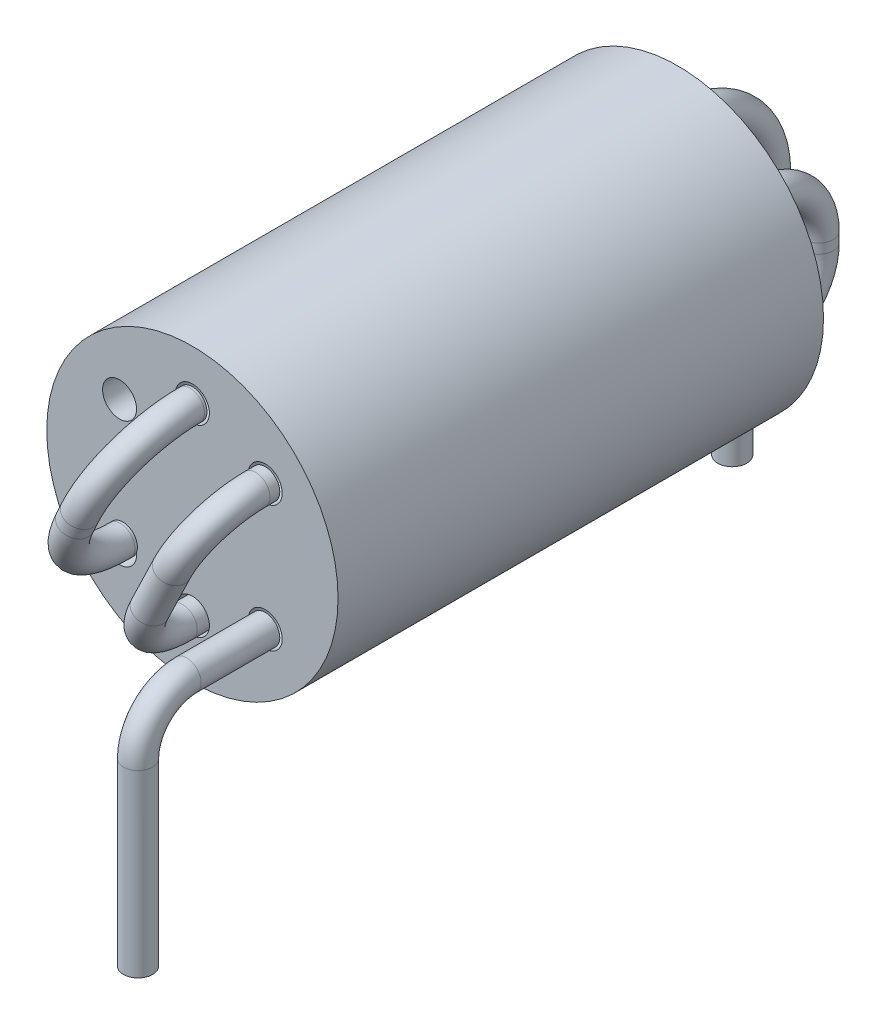
ISO-10303-21;
HEADER;
FILE_DESCRIPTION(('STEP AP214'),'2;1');
FILE_NAME('part.step','',(''),(''),'','','');
FILE_SCHEMA(('AUTOMOTIVE_DESIGN { 1 0 10303 214 1 1 1 1 }'));
ENDSEC;
DATA;
#1=APPLICATION_CONTEXT('core data for automotive mechanical design processes');
#2=APPLICATION_PROTOCOL_DEFINITION('international standard','automotive_design',2000,#1);
#3=PRODUCT_CONTEXT('',#1,'mechanical');
#4=PRODUCT('Part','Part','',(#3));
#5=PRODUCT_RELATED_PRODUCT_CATEGORY('part','',(#4));
#6=PRODUCT_DEFINITION_FORMATION('','',#4);
#7=PRODUCT_DEFINITION_CONTEXT('part definition',#1,'design');
#8=PRODUCT_DEFINITION('design','',#6,#7);
#9=PRODUCT_DEFINITION_SHAPE('','',#8);
#10=(LENGTH_UNIT() NAMED_UNIT(*) SI_UNIT(.MILLI.,.METRE.));
#11=(NAMED_UNIT(*) PLANE_ANGLE_UNIT() SI_UNIT($,.RADIAN.));
#12=(NAMED_UNIT(*) SI_UNIT($,.STERADIAN.) SOLID_ANGLE_UNIT());
#13=UNCERTAINTY_MEASURE_WITH_UNIT(LENGTH_MEASURE(1.E-05),#10,'distance_accuracy_value','');
#14=(GEOMETRIC_REPRESENTATION_CONTEXT(3) GLOBAL_UNCERTAINTY_ASSIGNED_CONTEXT((#13)) GLOBAL_UNIT_ASSIGNED_CONTEXT((#10,
#11,#12)) REPRESENTATION_CONTEXT('',''));
#15=CARTESIAN_POINT('',(0.,0.,0.));
#16=DIRECTION('',(0.,0.,1.));
#17=DIRECTION('',(1.,0.,0.));
#18=AXIS2_PLACEMENT_3D('',#15,#16,#17);
#19=CARTESIAN_POINT('',(5.75283767472248E-05,-1.80959341750815,10.2));
#20=DIRECTION('',(0.,0.,-1.));
#21=DIRECTION('',(0.,1.,0.));
#22=AXIS2_PLACEMENT_3D('',#19,#20,#21);
#23=CYLINDRICAL_SURFACE('',#22,0.3);
#24=CARTESIAN_POINT('',(5.75283767472248E-05,-1.80959341750815,10.2));
#25=DIRECTION('',(0.,0.,-1.));
#26=DIRECTION('',(0.622493133075413,-0.782625261075795,0.));
#27=AXIS2_PLACEMENT_3D('',#24,#25,#26);
#28=CIRCLE('',#27,0.3);
#29=CARTESIAN_POINT('',(-0.130279761036552,-2.07980109872464,10.2));
#30=VERTEX_POINT('',#29);
#31=EDGE_CURVE('E50',#30,#30,#28,.T.);
#32=ORIENTED_EDGE('',*,*,#31,.T.);
#33=EDGE_LOOP('',(#32));
#34=FACE_BOUND('',#33,.T.);
#35=CARTESIAN_POINT('',(5.75283767471164E-05,-1.80959341750815,9.80414751834978));
#36=DIRECTION('',(0.,0.,-1.));
#37=DIRECTION('',(0.622493133075413,-0.782625261075795,0.));
#38=AXIS2_PLACEMENT_3D('',#35,#36,#37);
#39=CIRCLE('',#38,0.3);
#40=CARTESIAN_POINT('',(0.186805468299371,-2.04438099583089,9.80414751834978));
#41=VERTEX_POINT('',#40);
#42=EDGE_CURVE('E11',#41,#41,#39,.T.);
#43=ORIENTED_EDGE('',*,*,#42,.F.);
#44=EDGE_LOOP('',(#43));
#45=FACE_BOUND('',#44,.T.);
#46=ADVANCED_FACE('F43',(#34,#45),#23,.T.);
#47=CARTESIAN_POINT('',(0.521406686029949,-0.728762692642181,10.2));
#48=DIRECTION('',(0.900692270721641,-0.434457631377668,0.));
#49=DIRECTION('',(0.434457631377668,0.900692270721641,0.));
#50=AXIS2_PLACEMENT_3D('',#47,#48,#49);
#51=TOROIDAL_SURFACE('',#50,1.2,0.3);
#52=CARTESIAN_POINT('',(0.521406686029949,-0.728762692642181,11.4));
#53=DIRECTION('',(-0.434457631377668,-0.900692270721641,0.));
#54=DIRECTION('',(0.811246566537707,-0.391312630537898,0.434457631377668));
#55=AXIS2_PLACEMENT_3D('',#52,#53,#54);
#56=CIRCLE('',#55,0.3);
#57=CARTESIAN_POINT('',(0.521406686029949,-0.728762692642181,11.7));
#58=VERTEX_POINT('',#57);
#59=EDGE_CURVE('E56',#58,#58,#56,.T.);
#60=CARTESIAN_POINT('',(0.521406686029949,-0.728762692642181,10.2));
#61=DIRECTION('',(0.900692270721641,-0.434457631377668,0.));
#62=DIRECTION('',(0.434457631377668,0.900692270721641,0.));
#63=AXIS2_PLACEMENT_3D('',#60,#61,#62);
#64=CIRCLE('',#63,1.5);
#65=EDGE_CURVE('',#58,#30,#64,.T.);
#66=ORIENTED_EDGE('',*,*,#59,.T.);
#67=ORIENTED_EDGE('',*,*,#31,.F.);
#68=ORIENTED_EDGE('',*,*,#65,.T.);
#69=ORIENTED_EDGE('',*,*,#65,.F.);
#70=EDGE_LOOP('',(#66,#68,#67,#69));
#71=FACE_BOUND('',#70,.T.);
#72=ADVANCED_FACE('F92',(#71),#51,.T.);
#73=CARTESIAN_POINT('',(0.978650842346798,0.21916927513403,11.4));
#74=DIRECTION('',(-0.434457631377668,-0.900692270721641,0.));
#75=DIRECTION('',(0.900692270721641,-0.434457631377668,0.));
#76=AXIS2_PLACEMENT_3D('',#73,#74,#75);
#77=CYLINDRICAL_SURFACE('',#76,0.3);
#78=CARTESIAN_POINT('',(0.978650842346798,0.21916927513403,11.4));
#79=DIRECTION('',(-0.434457631377668,-0.900692270721641,0.));
#80=DIRECTION('',(0.811246566537707,-0.391312630537898,0.434457631377668));
#81=AXIS2_PLACEMENT_3D('',#78,#79,#80);
#82=CIRCLE('',#81,0.3);
#83=CARTESIAN_POINT('',(0.978650842346798,0.21916927513403,11.7));
#84=VERTEX_POINT('',#83);
#85=EDGE_CURVE('E61',#84,#84,#82,.T.);
#86=ORIENTED_EDGE('',*,*,#85,.T.);
#87=EDGE_LOOP('',(#86));
#88=FACE_BOUND('',#87,.T.);
#89=ORIENTED_EDGE('',*,*,#59,.F.);
#90=EDGE_LOOP('',(#89));
#91=FACE_BOUND('',#90,.T.);
#92=ADVANCED_FACE('F95',(#88,#91),#77,.T.);
#93=CARTESIAN_POINT('',(0.978650842346798,0.21916927513403,10.2));
#94=DIRECTION('',(0.900692270721641,-0.434457631377668,0.));
#95=DIRECTION('',(0.434457631377668,0.900692270721641,0.));
#96=AXIS2_PLACEMENT_3D('',#93,#94,#95);
#97=TOROIDAL_SURFACE('',#96,1.2,0.3);
#98=CARTESIAN_POINT('',(1.5,1.3,10.2));
#99=DIRECTION('',(0.,0.,1.));
#100=DIRECTION('',(1.,0.,0.));
#101=AXIS2_PLACEMENT_3D('',#98,#99,#100);
#102=CIRCLE('',#101,0.3);
#103=CARTESIAN_POINT('',(1.6303372894133,1.57020768121649,10.2));
#104=VERTEX_POINT('',#103);
#105=EDGE_CURVE('E66',#104,#104,#102,.T.);
#106=CARTESIAN_POINT('',(0.978650842346798,0.21916927513403,10.2));
#107=DIRECTION('',(0.900692270721641,-0.434457631377668,0.));
#108=DIRECTION('',(0.434457631377668,0.900692270721641,0.));
#109=AXIS2_PLACEMENT_3D('',#106,#107,#108);
#110=CIRCLE('',#109,1.5);
#111=EDGE_CURVE('',#104,#84,#110,.T.);
#112=ORIENTED_EDGE('',*,*,#105,.T.);
#113=ORIENTED_EDGE('',*,*,#85,.F.);
#114=ORIENTED_EDGE('',*,*,#111,.T.);
#115=ORIENTED_EDGE('',*,*,#111,.F.);
#116=EDGE_LOOP('',(#112,#114,#113,#115));
#117=FACE_BOUND('',#116,.T.);
#118=ADVANCED_FACE('F75',(#117),#97,.T.);
#119=CARTESIAN_POINT('',(1.5,1.3,10.2));
#120=DIRECTION('',(0.,0.,-1.));
#121=DIRECTION('',(-1.,0.,0.));
#122=AXIS2_PLACEMENT_3D('',#119,#120,#121);
#123=CYLINDRICAL_SURFACE('',#122,0.3);
#124=ORIENTED_EDGE('',*,*,#105,.F.);
#125=EDGE_LOOP('',(#124));
#126=FACE_BOUND('',#125,.T.);
#127=CARTESIAN_POINT('',(1.5,1.3,10.));
#128=DIRECTION('',(0.,0.,1.));
#129=DIRECTION('',(1.,0.,0.));
#130=AXIS2_PLACEMENT_3D('',#127,#128,#129);
#131=CIRCLE('',#130,0.3);
#132=CARTESIAN_POINT('',(1.8,1.3,10.));
#133=VERTEX_POINT('',#132);
#134=EDGE_CURVE('E67',#133,#133,#131,.T.);
#135=ORIENTED_EDGE('',*,*,#134,.T.);
#136=EDGE_LOOP('',(#135));
#137=FACE_BOUND('',#136,.T.);
#138=ADVANCED_FACE('F78',(#126,#137),#123,.T.);
#139=CARTESIAN_POINT('',(5.75283767471164E-05,-1.80959341750815,9.80414751834978));
#140=DIRECTION('',(0.,0.,-1.));
#141=DIRECTION('',(0.622493133075413,-0.782625261075795,0.));
#142=AXIS2_PLACEMENT_3D('',#139,#140,#141);
#143=PLANE('',#142);
#144=ORIENTED_EDGE('',*,*,#42,.T.);
#145=EDGE_LOOP('',(#144));
#146=FACE_BOUND('',#145,.T.);
#147=ADVANCED_FACE('F81',(#146),#143,.T.);
#148=CARTESIAN_POINT('',(1.5,1.3,10.));
#149=DIRECTION('',(0.,0.,1.));
#150=DIRECTION('',(1.,0.,0.));
#151=AXIS2_PLACEMENT_3D('',#148,#149,#150);
#152=PLANE('',#151);
#153=ORIENTED_EDGE('',*,*,#134,.F.);
#154=EDGE_LOOP('',(#153));
#155=FACE_BOUND('',#154,.T.);
#156=ADVANCED_FACE('F85',(#155),#152,.F.);
#157=CLOSED_SHELL('',(#46,#72,#92,#118,#138,#147,#156));
#158=MANIFOLD_SOLID_BREP('B2',#157);
#159=CARTESIAN_POINT('',(1.5,-1.3,-0.2));
#160=DIRECTION('',(0.,0.,1.));
#161=DIRECTION('',(0.,-1.,0.));
#162=AXIS2_PLACEMENT_3D('',#159,#160,#161);
#163=CYLINDRICAL_SURFACE('',#162,0.3);
#164=CARTESIAN_POINT('',(1.5,-1.3,-0.2));
#165=DIRECTION('',(0.,0.,1.));
#166=DIRECTION('',(-1.,0.,0.));
#167=AXIS2_PLACEMENT_3D('',#164,#165,#166);
#168=CIRCLE('',#167,0.3);
#169=CARTESIAN_POINT('',(1.5,-1.6,-0.2));
#170=VERTEX_POINT('',#169);
#171=EDGE_CURVE('E171',#170,#170,#168,.T.);
#172=ORIENTED_EDGE('',*,*,#171,.T.);
#173=EDGE_LOOP('',(#172));
#174=FACE_BOUND('',#173,.T.);
#175=CARTESIAN_POINT('',(1.5,-1.3,0.));
#176=DIRECTION('',(0.,0.,1.));
#177=DIRECTION('',(-1.,0.,0.));
#178=AXIS2_PLACEMENT_3D('',#175,#176,#177);
#179=CIRCLE('',#178,0.3);
#180=CARTESIAN_POINT('',(1.2,-1.3,0.));
#181=VERTEX_POINT('',#180);
#182=EDGE_CURVE('E42',#181,#181,#179,.T.);
#183=ORIENTED_EDGE('',*,*,#182,.F.);
#184=EDGE_LOOP('',(#183));
#185=FACE_BOUND('',#184,.T.);
#186=ADVANCED_FACE('F164',(#174,#185),#163,.T.);
#187=CARTESIAN_POINT('',(1.5,-0.1,-0.2));
#188=DIRECTION('',(-1.,0.,0.));
#189=DIRECTION('',(0.,0.,1.));
#190=AXIS2_PLACEMENT_3D('',#187,#188,#189);
#191=TOROIDAL_SURFACE('',#190,1.2,0.3);
#192=CARTESIAN_POINT('',(1.5,-0.1,-1.4));
#193=DIRECTION('',(0.,-1.,0.));
#194=DIRECTION('',(-1.,0.,0.));
#195=AXIS2_PLACEMENT_3D('',#192,#193,#194);
#196=CIRCLE('',#195,0.3);
#197=CARTESIAN_POINT('',(1.5,-0.0999999999999999,-1.7));
#198=VERTEX_POINT('',#197);
#199=EDGE_CURVE('E177',#198,#198,#196,.T.);
#200=CARTESIAN_POINT('',(1.5,-0.1,-0.2));
#201=DIRECTION('',(-1.,0.,0.));
#202=DIRECTION('',(0.,0.,1.));
#203=AXIS2_PLACEMENT_3D('',#200,#201,#202);
#204=CIRCLE('',#203,1.5);
#205=EDGE_CURVE('',#198,#170,#204,.T.);
#206=ORIENTED_EDGE('',*,*,#199,.T.);
#207=ORIENTED_EDGE('',*,*,#171,.F.);
#208=ORIENTED_EDGE('',*,*,#205,.T.);
#209=ORIENTED_EDGE('',*,*,#205,.F.);
#210=EDGE_LOOP('',(#206,#208,#207,#209));
#211=FACE_BOUND('',#210,.T.);
#212=ADVANCED_FACE('F213',(#211),#191,.T.);
#213=CARTESIAN_POINT('',(1.5,0.1,-1.4));
#214=DIRECTION('',(0.,-1.,0.));
#215=DIRECTION('',(0.,0.,-1.));
#216=AXIS2_PLACEMENT_3D('',#213,#214,#215);
#217=CYLINDRICAL_SURFACE('',#216,0.3);
#218=CARTESIAN_POINT('',(1.5,0.1,-1.4));
#219=DIRECTION('',(0.,-1.,0.));
#220=DIRECTION('',(-1.,0.,0.));
#221=AXIS2_PLACEMENT_3D('',#218,#219,#220);
#222=CIRCLE('',#221,0.3);
#223=CARTESIAN_POINT('',(1.5,0.1,-1.7));
#224=VERTEX_POINT('',#223);
#225=EDGE_CURVE('E183',#224,#224,#222,.T.);
#226=ORIENTED_EDGE('',*,*,#225,.T.);
#227=EDGE_LOOP('',(#226));
#228=FACE_BOUND('',#227,.T.);
#229=ORIENTED_EDGE('',*,*,#199,.F.);
#230=EDGE_LOOP('',(#229));
#231=FACE_BOUND('',#230,.T.);
#232=ADVANCED_FACE('F216',(#228,#231),#217,.T.);
#233=CARTESIAN_POINT('',(1.5,0.1,-0.2));
#234=DIRECTION('',(-1.,0.,0.));
#235=DIRECTION('',(0.,0.,1.));
#236=AXIS2_PLACEMENT_3D('',#233,#234,#235);
#237=TOROIDAL_SURFACE('',#236,1.2,0.3);
#238=CARTESIAN_POINT('',(1.5,1.3,-0.2));
#239=DIRECTION('',(0.,0.,-1.));
#240=DIRECTION('',(-1.,0.,0.));
#241=AXIS2_PLACEMENT_3D('',#238,#239,#240);
#242=CIRCLE('',#241,0.3);
#243=CARTESIAN_POINT('',(1.5,1.6,-0.2));
#244=VERTEX_POINT('',#243);
#245=EDGE_CURVE('E189',#244,#244,#242,.T.);
#246=CARTESIAN_POINT('',(1.5,0.1,-0.2));
#247=DIRECTION('',(-1.,0.,0.));
#248=DIRECTION('',(0.,0.,1.));
#249=AXIS2_PLACEMENT_3D('',#246,#247,#248);
#250=CIRCLE('',#249,1.5);
#251=EDGE_CURVE('',#244,#224,#250,.T.);
#252=ORIENTED_EDGE('',*,*,#245,.T.);
#253=ORIENTED_EDGE('',*,*,#225,.F.);
#254=ORIENTED_EDGE('',*,*,#251,.T.);
#255=ORIENTED_EDGE('',*,*,#251,.F.);
#256=EDGE_LOOP('',(#252,#254,#253,#255));
#257=FACE_BOUND('',#256,.T.);
#258=ADVANCED_FACE('F196',(#257),#237,.T.);
#259=CARTESIAN_POINT('',(1.5,1.3,-0.2));
#260=DIRECTION('',(0.,0.,1.));
#261=DIRECTION('',(0.,-1.,0.));
#262=AXIS2_PLACEMENT_3D('',#259,#260,#261);
#263=CYLINDRICAL_SURFACE('',#262,0.3);
#264=ORIENTED_EDGE('',*,*,#245,.F.);
#265=EDGE_LOOP('',(#264));
#266=FACE_BOUND('',#265,.T.);
#267=CARTESIAN_POINT('',(1.5,1.3,0.));
#268=DIRECTION('',(0.,0.,-1.));
#269=DIRECTION('',(-1.,0.,0.));
#270=AXIS2_PLACEMENT_3D('',#267,#268,#269);
#271=CIRCLE('',#270,0.3);
#272=CARTESIAN_POINT('',(1.2,1.3,0.));
#273=VERTEX_POINT('',#272);
#274=EDGE_CURVE('E190',#273,#273,#271,.T.);
#275=ORIENTED_EDGE('',*,*,#274,.T.);
#276=EDGE_LOOP('',(#275));
#277=FACE_BOUND('',#276,.T.);
#278=ADVANCED_FACE('F199',(#266,#277),#263,.T.);
#279=CARTESIAN_POINT('',(1.5,-1.3,0.));
#280=DIRECTION('',(0.,0.,1.));
#281=DIRECTION('',(-1.,0.,0.));
#282=AXIS2_PLACEMENT_3D('',#279,#280,#281);
#283=PLANE('',#282);
#284=ORIENTED_EDGE('',*,*,#182,.T.);
#285=EDGE_LOOP('',(#284));
#286=FACE_BOUND('',#285,.T.);
#287=ADVANCED_FACE('F202',(#286),#283,.T.);
#288=CARTESIAN_POINT('',(1.5,1.3,0.));
#289=DIRECTION('',(0.,0.,-1.));
#290=DIRECTION('',(-1.,0.,0.));
#291=AXIS2_PLACEMENT_3D('',#288,#289,#290);
#292=PLANE('',#291);
#293=ORIENTED_EDGE('',*,*,#274,.F.);
#294=EDGE_LOOP('',(#293));
#295=FACE_BOUND('',#294,.T.);
#296=ADVANCED_FACE('F206',(#295),#292,.F.);
#297=CLOSED_SHELL('',(#186,#212,#232,#258,#278,#287,#296));
#298=MANIFOLD_SOLID_BREP('B6',#297);
#299=CARTESIAN_POINT('',(-1.5,-2.30000000000001,-2.62));
#300=DIRECTION('',(0.,-1.,0.));
#301=DIRECTION('',(0.,0.,-1.));
#302=AXIS2_PLACEMENT_3D('',#299,#300,#301);
#303=CYLINDRICAL_SURFACE('',#302,0.3);
#304=CARTESIAN_POINT('',(-1.5,-2.30000000000001,-2.62));
#305=DIRECTION('',(0.,-1.,0.));
#306=DIRECTION('',(-1.,0.,0.));
#307=AXIS2_PLACEMENT_3D('',#304,#305,#306);
#308=CIRCLE('',#307,0.3);
#309=CARTESIAN_POINT('',(-1.5,-2.30000000000001,-2.92));
#310=VERTEX_POINT('',#309);
#311=EDGE_CURVE('E292',#310,#310,#308,.T.);
#312=ORIENTED_EDGE('',*,*,#311,.T.);
#313=EDGE_LOOP('',(#312));
#314=FACE_BOUND('',#313,.T.);
#315=CARTESIAN_POINT('',(-1.5,-6.,-2.62));
#316=DIRECTION('',(0.,-1.,0.));
#317=DIRECTION('',(-1.,0.,0.));
#318=AXIS2_PLACEMENT_3D('',#315,#316,#317);
#319=CIRCLE('',#318,0.3);
#320=CARTESIAN_POINT('',(-1.8,-6.,-2.62));
#321=VERTEX_POINT('',#320);
#322=EDGE_CURVE('E163',#321,#321,#319,.T.);
#323=ORIENTED_EDGE('',*,*,#322,.F.);
#324=EDGE_LOOP('',(#323));
#325=FACE_BOUND('',#324,.T.);
#326=ADVANCED_FACE('F285',(#314,#325),#303,.T.);
#327=CARTESIAN_POINT('',(-1.5,-2.3,-1.62));
#328=DIRECTION('',(-1.,0.,0.));
#329=DIRECTION('',(0.,0.,1.));
#330=AXIS2_PLACEMENT_3D('',#327,#328,#329);
#331=TOROIDAL_SURFACE('',#330,1.,0.3);
#332=CARTESIAN_POINT('',(-1.5,-1.3,-1.61999999999999));
#333=DIRECTION('',(0.,0.,-1.));
#334=DIRECTION('',(-1.,0.,0.));
#335=AXIS2_PLACEMENT_3D('',#332,#333,#334);
#336=CIRCLE('',#335,0.3);
#337=CARTESIAN_POINT('',(-1.5,-1.,-1.61999999999999));
#338=VERTEX_POINT('',#337);
#339=EDGE_CURVE('E298',#338,#338,#336,.T.);
#340=CARTESIAN_POINT('',(-1.5,-2.3,-1.62));
#341=DIRECTION('',(-1.,0.,0.));
#342=DIRECTION('',(0.,0.,1.));
#343=AXIS2_PLACEMENT_3D('',#340,#341,#342);
#344=CIRCLE('',#343,1.3);
#345=EDGE_CURVE('',#338,#310,#344,.T.);
#346=ORIENTED_EDGE('',*,*,#339,.T.);
#347=ORIENTED_EDGE('',*,*,#311,.F.);
#348=ORIENTED_EDGE('',*,*,#345,.T.);
#349=ORIENTED_EDGE('',*,*,#345,.F.);
#350=EDGE_LOOP('',(#346,#348,#347,#349));
#351=FACE_BOUND('',#350,.T.);
#352=ADVANCED_FACE('F320',(#351),#331,.T.);
#353=CARTESIAN_POINT('',(-1.5,-1.3,-1.61999999999999));
#354=DIRECTION('',(0.,0.,1.));
#355=DIRECTION('',(1.,0.,0.));
#356=AXIS2_PLACEMENT_3D('',#353,#354,#355);
#357=CYLINDRICAL_SURFACE('',#356,0.3);
#358=ORIENTED_EDGE('',*,*,#339,.F.);
#359=EDGE_LOOP('',(#358));
#360=FACE_BOUND('',#359,.T.);
#361=CARTESIAN_POINT('',(-1.5,-1.3,0.));
#362=DIRECTION('',(0.,0.,-1.));
#363=DIRECTION('',(-1.,0.,0.));
#364=AXIS2_PLACEMENT_3D('',#361,#362,#363);
#365=CIRCLE('',#364,0.3);
#366=CARTESIAN_POINT('',(-1.8,-1.3,0.));
#367=VERTEX_POINT('',#366);
#368=EDGE_CURVE('E303',#367,#367,#365,.T.);
#369=ORIENTED_EDGE('',*,*,#368,.T.);
#370=EDGE_LOOP('',(#369));
#371=FACE_BOUND('',#370,.T.);
#372=ADVANCED_FACE('F309',(#360,#371),#357,.T.);
#373=CARTESIAN_POINT('',(-1.5,-6.,-2.62));
#374=DIRECTION('',(0.,-1.,0.));
#375=DIRECTION('',(-1.,0.,0.));
#376=AXIS2_PLACEMENT_3D('',#373,#374,#375);
#377=PLANE('',#376);
#378=ORIENTED_EDGE('',*,*,#322,.T.);
#379=EDGE_LOOP('',(#378));
#380=FACE_BOUND('',#379,.T.);
#381=ADVANCED_FACE('F313',(#380),#377,.T.);
#382=CARTESIAN_POINT('',(-1.5,-1.3,0.));
#383=DIRECTION('',(0.,0.,-1.));
#384=DIRECTION('',(-1.,0.,0.));
#385=AXIS2_PLACEMENT_3D('',#382,#383,#384);
#386=PLANE('',#385);
#387=ORIENTED_EDGE('',*,*,#368,.F.);
#388=EDGE_LOOP('',(#387));
#389=FACE_BOUND('',#388,.T.);
#390=ADVANCED_FACE('F311',(#389),#386,.F.);
#391=CLOSED_SHELL('',(#326,#352,#372,#381,#390));
#392=MANIFOLD_SOLID_BREP('B37',#391);
#393=CARTESIAN_POINT('',(0.,-1.80971268198998,-0.100000000000001));
#394=DIRECTION('',(0.,0.,1.));
#395=DIRECTION('',(1.,0.,0.));
#396=AXIS2_PLACEMENT_3D('',#393,#394,#395);
#397=CYLINDRICAL_SURFACE('',#396,0.299999999999999);
#398=CARTESIAN_POINT('',(0.,-1.80971268198998,-0.100000000000001));
#399=DIRECTION('',(0.,0.,1.));
#400=DIRECTION('',(-1.,0.,0.));
#401=AXIS2_PLACEMENT_3D('',#398,#399,#400);
#402=CIRCLE('',#401,0.299999999999999);
#403=CARTESIAN_POINT('',(0.,-2.10971268198998,-0.100000000000001));
#404=VERTEX_POINT('',#403);
#405=EDGE_CURVE('E379',#404,#404,#402,.T.);
#406=ORIENTED_EDGE('',*,*,#405,.T.);
#407=EDGE_LOOP('',(#406));
#408=FACE_BOUND('',#407,.T.);
#409=CARTESIAN_POINT('',(0.,-1.80971268198998,0.));
#410=DIRECTION('',(0.,0.,1.));
#411=DIRECTION('',(-1.,0.,0.));
#412=AXIS2_PLACEMENT_3D('',#409,#410,#411);
#413=CIRCLE('',#412,0.299999999999999);
#414=CARTESIAN_POINT('',(-0.299999999999999,-1.80971268198998,0.));
#415=VERTEX_POINT('',#414);
#416=EDGE_CURVE('E284',#415,#415,#413,.T.);
#417=ORIENTED_EDGE('',*,*,#416,.F.);
#418=EDGE_LOOP('',(#417));
#419=FACE_BOUND('',#418,.T.);
#420=ADVANCED_FACE('F372',(#408,#419),#397,.T.);
#421=CARTESIAN_POINT('',(0.,-0.00971268198998101,-0.1));
#422=DIRECTION('',(-1.,0.,0.));
#423=DIRECTION('',(0.,0.,1.));
#424=AXIS2_PLACEMENT_3D('',#421,#422,#423);
#425=TOROIDAL_SURFACE('',#424,1.8,0.299999999999999);
#426=CARTESIAN_POINT('',(0.,-0.00971268198998067,-1.9));
#427=DIRECTION('',(0.,-1.,0.));
#428=DIRECTION('',(-1.,0.,0.));
#429=AXIS2_PLACEMENT_3D('',#426,#427,#428);
#430=CIRCLE('',#429,0.299999999999999);
#431=CARTESIAN_POINT('',(0.,-0.00971268198998062,-2.2));
#432=VERTEX_POINT('',#431);
#433=EDGE_CURVE('E386',#432,#432,#430,.T.);
#434=CARTESIAN_POINT('',(0.,-0.00971268198998101,-0.1));
#435=DIRECTION('',(-1.,0.,0.));
#436=DIRECTION('',(0.,0.,1.));
#437=AXIS2_PLACEMENT_3D('',#434,#435,#436);
#438=CIRCLE('',#437,2.1);
#439=EDGE_CURVE('',#432,#404,#438,.T.);
#440=ORIENTED_EDGE('',*,*,#433,.T.);
#441=ORIENTED_EDGE('',*,*,#405,.F.);
#442=ORIENTED_EDGE('',*,*,#439,.T.);
#443=ORIENTED_EDGE('',*,*,#439,.F.);
#444=EDGE_LOOP('',(#440,#442,#441,#443));
#445=FACE_BOUND('',#444,.T.);
#446=ADVANCED_FACE('F421',(#445),#425,.T.);
#447=CARTESIAN_POINT('',(0.,0.176891682635779,-1.9));
#448=DIRECTION('',(0.,-1.,0.));
#449=DIRECTION('',(0.,0.,-1.));
#450=AXIS2_PLACEMENT_3D('',#447,#448,#449);
#451=CYLINDRICAL_SURFACE('',#450,0.299999999999999);
#452=CARTESIAN_POINT('',(0.,0.176891682635779,-1.9));
#453=DIRECTION('',(0.,-1.,0.));
#454=DIRECTION('',(-1.,0.,0.));
#455=AXIS2_PLACEMENT_3D('',#452,#453,#454);
#456=CIRCLE('',#455,0.299999999999999);
#457=CARTESIAN_POINT('',(0.,0.176891682635779,-2.2));
#458=VERTEX_POINT('',#457);
#459=EDGE_CURVE('E392',#458,#458,#456,.T.);
#460=ORIENTED_EDGE('',*,*,#459,.T.);
#461=EDGE_LOOP('',(#460));
#462=FACE_BOUND('',#461,.T.);
#463=ORIENTED_EDGE('',*,*,#433,.F.);
#464=EDGE_LOOP('',(#463));
#465=FACE_BOUND('',#464,.T.);
#466=ADVANCED_FACE('F424',(#462,#465),#451,.T.);
#467=CARTESIAN_POINT('',(0.,0.176891682635779,-0.1));
#468=DIRECTION('',(-1.,0.,0.));
#469=DIRECTION('',(0.,0.,1.));
#470=AXIS2_PLACEMENT_3D('',#467,#468,#469);
#471=TOROIDAL_SURFACE('',#470,1.8,0.299999999999999);
#472=CARTESIAN_POINT('',(0.,1.97689168263578,-0.1));
#473=DIRECTION('',(0.,0.,-1.));
#474=DIRECTION('',(-1.,0.,0.));
#475=AXIS2_PLACEMENT_3D('',#472,#473,#474);
#476=CIRCLE('',#475,0.299999999999999);
#477=CARTESIAN_POINT('',(0.,2.27689168263578,-0.1));
#478=VERTEX_POINT('',#477);
#479=EDGE_CURVE('E397',#478,#478,#476,.T.);
#480=CARTESIAN_POINT('',(0.,0.176891682635779,-0.1));
#481=DIRECTION('',(-1.,0.,0.));
#482=DIRECTION('',(0.,0.,1.));
#483=AXIS2_PLACEMENT_3D('',#480,#481,#482);
#484=CIRCLE('',#483,2.1);
#485=EDGE_CURVE('',#478,#458,#484,.T.);
#486=ORIENTED_EDGE('',*,*,#479,.T.);
#487=ORIENTED_EDGE('',*,*,#459,.F.);
#488=ORIENTED_EDGE('',*,*,#485,.T.);
#489=ORIENTED_EDGE('',*,*,#485,.F.);
#490=EDGE_LOOP('',(#486,#488,#487,#489));
#491=FACE_BOUND('',#490,.T.);
#492=ADVANCED_FACE('F404',(#491),#471,.T.);
#493=CARTESIAN_POINT('',(0.,1.97689168263578,-0.1));
#494=DIRECTION('',(0.,0.,1.));
#495=DIRECTION('',(0.,-1.,0.));
#496=AXIS2_PLACEMENT_3D('',#493,#494,#495);
#497=CYLINDRICAL_SURFACE('',#496,0.299999999999999);
#498=ORIENTED_EDGE('',*,*,#479,.F.);
#499=EDGE_LOOP('',(#498));
#500=FACE_BOUND('',#499,.T.);
#501=CARTESIAN_POINT('',(0.,1.97689168263578,0.));
#502=DIRECTION('',(0.,0.,-1.));
#503=DIRECTION('',(-1.,0.,0.));
#504=AXIS2_PLACEMENT_3D('',#501,#502,#503);
#505=CIRCLE('',#504,0.299999999999999);
#506=CARTESIAN_POINT('',(-0.299999999999999,1.97689168263578,0.));
#507=VERTEX_POINT('',#506);
#508=EDGE_CURVE('E398',#507,#507,#505,.T.);
#509=ORIENTED_EDGE('',*,*,#508,.T.);
#510=EDGE_LOOP('',(#509));
#511=FACE_BOUND('',#510,.T.);
#512=ADVANCED_FACE('F407',(#500,#511),#497,.T.);
#513=CARTESIAN_POINT('',(0.,-1.80971268198998,0.));
#514=DIRECTION('',(0.,0.,1.));
#515=DIRECTION('',(-1.,0.,0.));
#516=AXIS2_PLACEMENT_3D('',#513,#514,#515);
#517=PLANE('',#516);
#518=ORIENTED_EDGE('',*,*,#416,.T.);
#519=EDGE_LOOP('',(#518));
#520=FACE_BOUND('',#519,.T.);
#521=ADVANCED_FACE('F410',(#520),#517,.T.);
#522=CARTESIAN_POINT('',(0.,1.97689168263578,0.));
#523=DIRECTION('',(0.,0.,-1.));
#524=DIRECTION('',(-1.,0.,0.));
#525=AXIS2_PLACEMENT_3D('',#522,#523,#524);
#526=PLANE('',#525);
#527=ORIENTED_EDGE('',*,*,#508,.F.);
#528=EDGE_LOOP('',(#527));
#529=FACE_BOUND('',#528,.T.);
#530=ADVANCED_FACE('F414',(#529),#526,.F.);
#531=CLOSED_SHELL('',(#420,#446,#466,#492,#512,#521,#530));
#532=MANIFOLD_SOLID_BREP('B158',#531);
#533=CARTESIAN_POINT('',(1.5,-2.3,12.62));
#534=DIRECTION('',(0.,-1.,0.));
#535=DIRECTION('',(0.,0.,-1.));
#536=AXIS2_PLACEMENT_3D('',#533,#534,#535);
#537=CYLINDRICAL_SURFACE('',#536,0.3);
#538=CARTESIAN_POINT('',(1.5,-2.3,12.62));
#539=DIRECTION('',(0.,-1.,0.));
#540=DIRECTION('',(1.,0.,0.));
#541=AXIS2_PLACEMENT_3D('',#538,#539,#540);
#542=CIRCLE('',#541,0.3);
#543=CARTESIAN_POINT('',(1.5,-2.3,12.92));
#544=VERTEX_POINT('',#543);
#545=EDGE_CURVE('E501',#544,#544,#542,.T.);
#546=ORIENTED_EDGE('',*,*,#545,.T.);
#547=EDGE_LOOP('',(#546));
#548=FACE_BOUND('',#547,.T.);
#549=CARTESIAN_POINT('',(1.5,-6.,12.62));
#550=DIRECTION('',(0.,-1.,0.));
#551=DIRECTION('',(1.,0.,0.));
#552=AXIS2_PLACEMENT_3D('',#549,#550,#551);
#553=CIRCLE('',#552,0.3);
#554=CARTESIAN_POINT('',(1.8,-6.,12.62));
#555=VERTEX_POINT('',#554);
#556=EDGE_CURVE('E371',#555,#555,#553,.T.);
#557=ORIENTED_EDGE('',*,*,#556,.F.);
#558=EDGE_LOOP('',(#557));
#559=FACE_BOUND('',#558,.T.);
#560=ADVANCED_FACE('F494',(#548,#559),#537,.T.);
#561=CARTESIAN_POINT('',(1.5,-2.3,11.62));
#562=DIRECTION('',(1.,0.,0.));
#563=DIRECTION('',(0.,0.,-1.));
#564=AXIS2_PLACEMENT_3D('',#561,#562,#563);
#565=TOROIDAL_SURFACE('',#564,1.,0.3);
#566=CARTESIAN_POINT('',(1.5,-1.3,11.62));
#567=DIRECTION('',(0.,0.,1.));
#568=DIRECTION('',(1.,0.,0.));
#569=AXIS2_PLACEMENT_3D('',#566,#567,#568);
#570=CIRCLE('',#569,0.3);
#571=CARTESIAN_POINT('',(1.5,-1.,11.62));
#572=VERTEX_POINT('',#571);
#573=EDGE_CURVE('E507',#572,#572,#570,.T.);
#574=CARTESIAN_POINT('',(1.5,-2.3,11.62));
#575=DIRECTION('',(1.,0.,0.));
#576=DIRECTION('',(0.,0.,-1.));
#577=AXIS2_PLACEMENT_3D('',#574,#575,#576);
#578=CIRCLE('',#577,1.3);
#579=EDGE_CURVE('',#572,#544,#578,.T.);
#580=ORIENTED_EDGE('',*,*,#573,.T.);
#581=ORIENTED_EDGE('',*,*,#545,.F.);
#582=ORIENTED_EDGE('',*,*,#579,.T.);
#583=ORIENTED_EDGE('',*,*,#579,.F.);
#584=EDGE_LOOP('',(#580,#582,#581,#583));
#585=FACE_BOUND('',#584,.T.);
#586=ADVANCED_FACE('F529',(#585),#565,.T.);
#587=CARTESIAN_POINT('',(1.5,-1.3,11.62));
#588=DIRECTION('',(0.,0.,-1.));
#589=DIRECTION('',(0.,1.,0.));
#590=AXIS2_PLACEMENT_3D('',#587,#588,#589);
#591=CYLINDRICAL_SURFACE('',#590,0.3);
#592=ORIENTED_EDGE('',*,*,#573,.F.);
#593=EDGE_LOOP('',(#592));
#594=FACE_BOUND('',#593,.T.);
#595=CARTESIAN_POINT('',(1.5,-1.3,10.));
#596=DIRECTION('',(0.,0.,1.));
#597=DIRECTION('',(1.,0.,0.));
#598=AXIS2_PLACEMENT_3D('',#595,#596,#597);
#599=CIRCLE('',#598,0.3);
#600=CARTESIAN_POINT('',(1.8,-1.3,10.));
#601=VERTEX_POINT('',#600);
#602=EDGE_CURVE('E512',#601,#601,#599,.T.);
#603=ORIENTED_EDGE('',*,*,#602,.T.);
#604=EDGE_LOOP('',(#603));
#605=FACE_BOUND('',#604,.T.);
#606=ADVANCED_FACE('F518',(#594,#605),#591,.T.);
#607=CARTESIAN_POINT('',(1.5,-6.,12.62));
#608=DIRECTION('',(0.,-1.,0.));
#609=DIRECTION('',(1.,0.,0.));
#610=AXIS2_PLACEMENT_3D('',#607,#608,#609);
#611=PLANE('',#610);
#612=ORIENTED_EDGE('',*,*,#556,.T.);
#613=EDGE_LOOP('',(#612));
#614=FACE_BOUND('',#613,.T.);
#615=ADVANCED_FACE('F522',(#614),#611,.T.);
#616=CARTESIAN_POINT('',(1.5,-1.3,10.));
#617=DIRECTION('',(0.,0.,1.));
#618=DIRECTION('',(1.,0.,0.));
#619=AXIS2_PLACEMENT_3D('',#616,#617,#618);
#620=PLANE('',#619);
#621=ORIENTED_EDGE('',*,*,#602,.F.);
#622=EDGE_LOOP('',(#621));
#623=FACE_BOUND('',#622,.T.);
#624=ADVANCED_FACE('F520',(#623),#620,.F.);
#625=CLOSED_SHELL('',(#560,#586,#606,#615,#624));
#626=MANIFOLD_SOLID_BREP('B279',#625);
#627=CARTESIAN_POINT('',(0.,0.,10.));
#628=DIRECTION('',(0.,0.,-1.));
#629=DIRECTION('',(-1.,0.,0.));
#630=AXIS2_PLACEMENT_3D('',#627,#628,#629);
#631=CYLINDRICAL_SURFACE('',#630,3.);
#632=CARTESIAN_POINT('',(0.,0.,10.));
#633=DIRECTION('',(0.,0.,1.));
#634=DIRECTION('',(1.,0.,0.));
#635=AXIS2_PLACEMENT_3D('',#632,#633,#634);
#636=CIRCLE('',#635,3.);
#637=CARTESIAN_POINT('',(3.,0.,10.));
#638=VERTEX_POINT('',#637);
#639=EDGE_CURVE('E582',#638,#638,#636,.T.);
#640=ORIENTED_EDGE('',*,*,#639,.F.);
#641=EDGE_LOOP('',(#640));
#642=FACE_BOUND('',#641,.T.);
#643=CARTESIAN_POINT('',(0.,0.,0.));
#644=DIRECTION('',(0.,0.,1.));
#645=DIRECTION('',(1.,0.,0.));
#646=AXIS2_PLACEMENT_3D('',#643,#644,#645);
#647=CIRCLE('',#646,3.);
#648=CARTESIAN_POINT('',(3.,0.,0.));
#649=VERTEX_POINT('',#648);
#650=EDGE_CURVE('E576',#649,#649,#647,.T.);
#651=ORIENTED_EDGE('',*,*,#650,.T.);
#652=EDGE_LOOP('',(#651));
#653=FACE_BOUND('',#652,.T.);
#654=ADVANCED_FACE('F573',(#642,#653),#631,.T.);
#655=CARTESIAN_POINT('',(0.,0.,10.));
#656=DIRECTION('',(0.,0.,1.));
#657=DIRECTION('',(1.,0.,0.));
#658=AXIS2_PLACEMENT_3D('',#655,#656,#657);
#659=PLANE('',#658);
#660=CARTESIAN_POINT('',(-1.43304674707494,-1.15373429490964,10.));
#661=DIRECTION('',(0.,0.,1.));
#662=DIRECTION('',(1.,0.,0.));
#663=AXIS2_PLACEMENT_3D('',#660,#661,#662);
#664=CIRCLE('',#663,0.3);
#665=CARTESIAN_POINT('',(-1.15234120467315,-1.2595851261058,10.));
#666=VERTEX_POINT('',#665);
#667=CARTESIAN_POINT('',(-1.69661420136194,-1.01044369144706,10.));
#668=VERTEX_POINT('',#667);
#669=EDGE_CURVE('E492',#666,#668,#664,.T.);
#670=ORIENTED_EDGE('',*,*,#669,.F.);
#671=CARTESIAN_POINT('',(-1.5,-1.3,10.));
#672=DIRECTION('',(0.,0.,1.));
#673=DIRECTION('',(1.,0.,0.));
#674=AXIS2_PLACEMENT_3D('',#671,#672,#673);
#675=CIRCLE('',#674,0.35);
#676=EDGE_CURVE('E595',#668,#666,#675,.T.);
#677=ORIENTED_EDGE('',*,*,#676,.F.);
#678=EDGE_LOOP('',(#670,#677));
#679=FACE_BOUND('',#678,.T.);
#680=CARTESIAN_POINT('',(1.5,-1.3,10.));
#681=DIRECTION('',(0.,0.,1.));
#682=DIRECTION('',(1.,0.,0.));
#683=AXIS2_PLACEMENT_3D('',#680,#681,#682);
#684=CIRCLE('',#683,0.35);
#685=CARTESIAN_POINT('',(1.85,-1.3,10.));
#686=VERTEX_POINT('',#685);
#687=EDGE_CURVE('E631',#686,#686,#684,.T.);
#688=ORIENTED_EDGE('',*,*,#687,.F.);
#689=EDGE_LOOP('',(#688));
#690=FACE_BOUND('',#689,.T.);
#691=CARTESIAN_POINT('',(1.5,1.3,10.));
#692=DIRECTION('',(0.,0.,1.));
#693=DIRECTION('',(1.,0.,0.));
#694=AXIS2_PLACEMENT_3D('',#691,#692,#693);
#695=CIRCLE('',#694,0.35);
#696=CARTESIAN_POINT('',(1.85,1.3,10.));
#697=VERTEX_POINT('',#696);
#698=EDGE_CURVE('E636',#697,#697,#695,.T.);
#699=ORIENTED_EDGE('',*,*,#698,.F.);
#700=EDGE_LOOP('',(#699));
#701=FACE_BOUND('',#700,.T.);
#702=CARTESIAN_POINT('',(-1.5,1.3,10.));
#703=DIRECTION('',(0.,0.,1.));
#704=DIRECTION('',(1.,0.,0.));
#705=AXIS2_PLACEMENT_3D('',#702,#703,#704);
#706=CIRCLE('',#705,0.35);
#707=CARTESIAN_POINT('',(-1.15,1.3,10.));
#708=VERTEX_POINT('',#707);
#709=EDGE_CURVE('E644',#708,#708,#706,.T.);
#710=ORIENTED_EDGE('',*,*,#709,.F.);
#711=EDGE_LOOP('',(#710));
#712=FACE_BOUND('',#711,.T.);
#713=CARTESIAN_POINT('',(0.,1.97689168263578,10.));
#714=DIRECTION('',(0.,0.,1.));
#715=DIRECTION('',(1.,0.,0.));
#716=AXIS2_PLACEMENT_3D('',#713,#714,#715);
#717=CIRCLE('',#716,0.35);
#718=CARTESIAN_POINT('',(0.35,1.97689168263578,10.));
#719=VERTEX_POINT('',#718);
#720=EDGE_CURVE('E652',#719,#719,#717,.T.);
#721=ORIENTED_EDGE('',*,*,#720,.F.);
#722=EDGE_LOOP('',(#721));
#723=FACE_BOUND('',#722,.T.);
#724=CARTESIAN_POINT('',(0.,-1.80971268198998,10.));
#725=DIRECTION('',(0.,0.,1.));
#726=DIRECTION('',(1.,0.,0.));
#727=AXIS2_PLACEMENT_3D('',#724,#725,#726);
#728=CIRCLE('',#727,0.35);
#729=CARTESIAN_POINT('',(0.35,-1.80971268198998,10.));
#730=VERTEX_POINT('',#729);
#731=EDGE_CURVE('E660',#730,#730,#728,.T.);
#732=ORIENTED_EDGE('',*,*,#731,.F.);
#733=EDGE_LOOP('',(#732));
#734=FACE_BOUND('',#733,.T.);
#735=ORIENTED_EDGE('',*,*,#639,.T.);
#736=EDGE_LOOP('',(#735));
#737=FACE_BOUND('',#736,.T.);
#738=ADVANCED_FACE('F602',(#679,#690,#701,#712,#723,#734,#737),#659,.T.);
#739=CARTESIAN_POINT('',(0.,0.,0.));
#740=DIRECTION('',(0.,0.,1.));
#741=DIRECTION('',(1.,0.,0.));
#742=AXIS2_PLACEMENT_3D('',#739,#740,#741);
#743=PLANE('',#742);
#744=CARTESIAN_POINT('',(1.5,-1.3,0.));
#745=DIRECTION('',(0.,0.,1.));
#746=DIRECTION('',(1.,0.,0.));
#747=AXIS2_PLACEMENT_3D('',#744,#745,#746);
#748=CIRCLE('',#747,0.35);
#749=CARTESIAN_POINT('',(1.85,-1.3,0.));
#750=VERTEX_POINT('',#749);
#751=EDGE_CURVE('E632',#750,#750,#748,.T.);
#752=ORIENTED_EDGE('',*,*,#751,.T.);
#753=EDGE_LOOP('',(#752));
#754=FACE_BOUND('',#753,.T.);
#755=CARTESIAN_POINT('',(1.5,1.3,0.));
#756=DIRECTION('',(0.,0.,1.));
#757=DIRECTION('',(1.,0.,0.));
#758=AXIS2_PLACEMENT_3D('',#755,#756,#757);
#759=CIRCLE('',#758,0.35);
#760=CARTESIAN_POINT('',(1.85,1.3,0.));
#761=VERTEX_POINT('',#760);
#762=EDGE_CURVE('E640',#761,#761,#759,.T.);
#763=ORIENTED_EDGE('',*,*,#762,.T.);
#764=EDGE_LOOP('',(#763));
#765=FACE_BOUND('',#764,.T.);
#766=CARTESIAN_POINT('',(-1.5,1.3,0.));
#767=DIRECTION('',(0.,0.,1.));
#768=DIRECTION('',(1.,0.,0.));
#769=AXIS2_PLACEMENT_3D('',#766,#767,#768);
#770=CIRCLE('',#769,0.35);
#771=CARTESIAN_POINT('',(-1.15,1.3,0.));
#772=VERTEX_POINT('',#771);
#773=EDGE_CURVE('E648',#772,#772,#770,.T.);
#774=ORIENTED_EDGE('',*,*,#773,.T.);
#775=EDGE_LOOP('',(#774));
#776=FACE_BOUND('',#775,.T.);
#777=CARTESIAN_POINT('',(0.,1.97689168263578,0.));
#778=DIRECTION('',(0.,0.,1.));
#779=DIRECTION('',(1.,0.,0.));
#780=AXIS2_PLACEMENT_3D('',#777,#778,#779);
#781=CIRCLE('',#780,0.35);
#782=CARTESIAN_POINT('',(0.35,1.97689168263578,0.));
#783=VERTEX_POINT('',#782);
#784=EDGE_CURVE('E656',#783,#783,#781,.T.);
#785=ORIENTED_EDGE('',*,*,#784,.T.);
#786=EDGE_LOOP('',(#785));
#787=FACE_BOUND('',#786,.T.);
#788=CARTESIAN_POINT('',(0.,-1.80971268198998,0.));
#789=DIRECTION('',(0.,0.,1.));
#790=DIRECTION('',(1.,0.,0.));
#791=AXIS2_PLACEMENT_3D('',#788,#789,#790);
#792=CIRCLE('',#791,0.35);
#793=CARTESIAN_POINT('',(0.35,-1.80971268198998,0.));
#794=VERTEX_POINT('',#793);
#795=EDGE_CURVE('E605',#794,#794,#792,.T.);
#796=ORIENTED_EDGE('',*,*,#795,.T.);
#797=EDGE_LOOP('',(#796));
#798=FACE_BOUND('',#797,.T.);
#799=CARTESIAN_POINT('',(-1.5,-1.3,0.));
#800=DIRECTION('',(0.,0.,1.));
#801=DIRECTION('',(1.,0.,0.));
#802=AXIS2_PLACEMENT_3D('',#799,#800,#801);
#803=CIRCLE('',#802,0.35);
#804=CARTESIAN_POINT('',(-1.15,-1.3,0.));
#805=VERTEX_POINT('',#804);
#806=EDGE_CURVE('E600',#805,#805,#803,.T.);
#807=ORIENTED_EDGE('',*,*,#806,.T.);
#808=EDGE_LOOP('',(#807));
#809=FACE_BOUND('',#808,.T.);
#810=ORIENTED_EDGE('',*,*,#650,.F.);
#811=EDGE_LOOP('',(#810));
#812=FACE_BOUND('',#811,.T.);
#813=ADVANCED_FACE('F681',(#754,#765,#776,#787,#798,#809,#812),#743,.F.);
#814=CARTESIAN_POINT('',(-1.5,-1.3,0.));
#815=DIRECTION('',(0.,0.,1.));
#816=DIRECTION('',(1.,0.,0.));
#817=AXIS2_PLACEMENT_3D('',#814,#815,#816);
#818=CYLINDRICAL_SURFACE('',#817,0.35);
#819=ORIENTED_EDGE('',*,*,#806,.F.);
#820=EDGE_LOOP('',(#819));
#821=FACE_BOUND('',#820,.T.);
#822=EDGE_CURVE('E593',#666,#668,#675,.T.);
#823=ORIENTED_EDGE('',*,*,#822,.T.);
#824=ORIENTED_EDGE('',*,*,#676,.T.);
#825=EDGE_LOOP('',(#823,#824));
#826=FACE_BOUND('',#825,.T.);
#827=ADVANCED_FACE('F594',(#821,#826),#818,.F.);
#828=CARTESIAN_POINT('',(0.,-1.80971268198998,0.));
#829=DIRECTION('',(0.,0.,1.));
#830=DIRECTION('',(1.,0.,0.));
#831=AXIS2_PLACEMENT_3D('',#828,#829,#830);
#832=CYLINDRICAL_SURFACE('',#831,0.35);
#833=ORIENTED_EDGE('',*,*,#795,.F.);
#834=EDGE_LOOP('',(#833));
#835=FACE_BOUND('',#834,.T.);
#836=ORIENTED_EDGE('',*,*,#731,.T.);
#837=EDGE_LOOP('',(#836));
#838=FACE_BOUND('',#837,.T.);
#839=ADVANCED_FACE('F687',(#835,#838),#832,.F.);
#840=CARTESIAN_POINT('',(0.,1.97689168263578,0.));
#841=DIRECTION('',(0.,0.,1.));
#842=DIRECTION('',(1.,0.,0.));
#843=AXIS2_PLACEMENT_3D('',#840,#841,#842);
#844=CYLINDRICAL_SURFACE('',#843,0.35);
#845=ORIENTED_EDGE('',*,*,#784,.F.);
#846=EDGE_LOOP('',(#845));
#847=FACE_BOUND('',#846,.T.);
#848=ORIENTED_EDGE('',*,*,#720,.T.);
#849=EDGE_LOOP('',(#848));
#850=FACE_BOUND('',#849,.T.);
#851=ADVANCED_FACE('F807',(#847,#850),#844,.F.);
#852=CARTESIAN_POINT('',(-1.5,1.3,0.));
#853=DIRECTION('',(0.,0.,1.));
#854=DIRECTION('',(1.,0.,0.));
#855=AXIS2_PLACEMENT_3D('',#852,#853,#854);
#856=CYLINDRICAL_SURFACE('',#855,0.35);
#857=ORIENTED_EDGE('',*,*,#773,.F.);
#858=EDGE_LOOP('',(#857));
#859=FACE_BOUND('',#858,.T.);
#860=ORIENTED_EDGE('',*,*,#709,.T.);
#861=EDGE_LOOP('',(#860));
#862=FACE_BOUND('',#861,.T.);
#863=ADVANCED_FACE('F801',(#859,#862),#856,.F.);
#864=CARTESIAN_POINT('',(1.5,1.3,0.));
#865=DIRECTION('',(0.,0.,1.));
#866=DIRECTION('',(1.,0.,0.));
#867=AXIS2_PLACEMENT_3D('',#864,#865,#866);
#868=CYLINDRICAL_SURFACE('',#867,0.35);
#869=ORIENTED_EDGE('',*,*,#762,.F.);
#870=EDGE_LOOP('',(#869));
#871=FACE_BOUND('',#870,.T.);
#872=ORIENTED_EDGE('',*,*,#698,.T.);
#873=EDGE_LOOP('',(#872));
#874=FACE_BOUND('',#873,.T.);
#875=ADVANCED_FACE('F795',(#871,#874),#868,.F.);
#876=CARTESIAN_POINT('',(1.5,-1.3,0.));
#877=DIRECTION('',(0.,0.,1.));
#878=DIRECTION('',(1.,0.,0.));
#879=AXIS2_PLACEMENT_3D('',#876,#877,#878);
#880=CYLINDRICAL_SURFACE('',#879,0.35);
#881=ORIENTED_EDGE('',*,*,#751,.F.);
#882=EDGE_LOOP('',(#881));
#883=FACE_BOUND('',#882,.T.);
#884=ORIENTED_EDGE('',*,*,#687,.T.);
#885=EDGE_LOOP('',(#884));
#886=FACE_BOUND('',#885,.T.);
#887=ADVANCED_FACE('F705',(#883,#886),#880,.F.);
#888=CARTESIAN_POINT('',(0.,1.97689168263578,10.05));
#889=DIRECTION('',(0.,0.,-1.));
#890=DIRECTION('',(-1.,0.,0.));
#891=AXIS2_PLACEMENT_3D('',#888,#889,#890);
#892=CYLINDRICAL_SURFACE('',#891,0.3);
#893=CARTESIAN_POINT('',(0.,1.97689168263578,10.05));
#894=DIRECTION('',(0.,0.,-1.));
#895=DIRECTION('',(0.653526841510851,-0.756903340873094,0.));
#896=AXIS2_PLACEMENT_3D('',#893,#894,#895);
#897=CIRCLE('',#896,0.3);
#898=CARTESIAN_POINT('',(0.124865095731401,2.24967127840494,10.05));
#899=VERTEX_POINT('',#898);
#900=EDGE_CURVE('E623',#899,#899,#897,.T.);
#901=ORIENTED_EDGE('',*,*,#900,.T.);
#902=EDGE_LOOP('',(#901));
#903=FACE_BOUND('',#902,.T.);
#904=CARTESIAN_POINT('',(0.,1.97689168263578,10.));
#905=DIRECTION('',(0.,0.,-1.));
#906=DIRECTION('',(0.653526841510851,-0.756903340873094,0.));
#907=AXIS2_PLACEMENT_3D('',#904,#905,#906);
#908=CIRCLE('',#907,0.3);
#909=CARTESIAN_POINT('',(0.196058052453256,1.74982068037385,10.));
#910=VERTEX_POINT('',#909);
#911=EDGE_CURVE('E627',#910,#910,#908,.T.);
#912=ORIENTED_EDGE('',*,*,#911,.F.);
#913=EDGE_LOOP('',(#912));
#914=FACE_BOUND('',#913,.T.);
#915=ADVANCED_FACE('F720',(#903,#914),#892,.T.);
#916=CARTESIAN_POINT('',(-0.665947177234134,0.522067171866906,10.05));
#917=DIRECTION('',(-0.909265319230545,0.416216985771334,0.));
#918=DIRECTION('',(-0.416216985771334,-0.909265319230545,0.));
#919=AXIS2_PLACEMENT_3D('',#916,#917,#918);
#920=TOROIDAL_SURFACE('',#919,1.6,0.3);
#921=CARTESIAN_POINT('',(-0.665947177234134,0.522067171866906,11.65));
#922=DIRECTION('',(0.416216985771334,0.909265319230545,0.));
#923=DIRECTION('',(0.826763420755425,-0.378451670436547,-0.416216985771334));
#924=AXIS2_PLACEMENT_3D('',#921,#922,#923);
#925=CIRCLE('',#924,0.3);
#926=CARTESIAN_POINT('',(-0.665947177234134,0.522067171866906,11.95));
#927=VERTEX_POINT('',#926);
#928=EDGE_CURVE('E619',#927,#927,#925,.T.);
#929=CARTESIAN_POINT('',(-0.665947177234134,0.522067171866906,10.05));
#930=DIRECTION('',(-0.909265319230545,0.416216985771334,0.));
#931=DIRECTION('',(-0.416216985771334,-0.909265319230545,0.));
#932=AXIS2_PLACEMENT_3D('',#929,#930,#931);
#933=CIRCLE('',#932,1.9);
#934=EDGE_CURVE('',#927,#899,#933,.T.);
#935=ORIENTED_EDGE('',*,*,#928,.T.);
#936=ORIENTED_EDGE('',*,*,#900,.F.);
#937=ORIENTED_EDGE('',*,*,#934,.T.);
#938=ORIENTED_EDGE('',*,*,#934,.F.);
#939=EDGE_LOOP('',(#935,#937,#936,#938));
#940=FACE_BOUND('',#939,.T.);
#941=ADVANCED_FACE('F726',(#940),#920,.T.);
#942=CARTESIAN_POINT('',(-0.767099569840805,0.301090215859234,11.65));
#943=DIRECTION('',(0.416216985771334,0.909265319230545,0.));
#944=DIRECTION('',(-0.909265319230545,0.416216985771334,0.));
#945=AXIS2_PLACEMENT_3D('',#942,#943,#944);
#946=CYLINDRICAL_SURFACE('',#945,0.3);
#947=CARTESIAN_POINT('',(-0.767099569840805,0.301090215859234,11.65));
#948=DIRECTION('',(0.416216985771334,0.909265319230545,0.));
#949=DIRECTION('',(0.826763420755425,-0.378451670436547,-0.416216985771334));
#950=AXIS2_PLACEMENT_3D('',#947,#948,#949);
#951=CIRCLE('',#950,0.3);
#952=CARTESIAN_POINT('',(-0.767099569840805,0.301090215859234,11.95));
#953=VERTEX_POINT('',#952);
#954=EDGE_CURVE('E614',#953,#953,#951,.T.);
#955=ORIENTED_EDGE('',*,*,#954,.T.);
#956=EDGE_LOOP('',(#955));
#957=FACE_BOUND('',#956,.T.);
#958=ORIENTED_EDGE('',*,*,#928,.F.);
#959=EDGE_LOOP('',(#958));
#960=FACE_BOUND('',#959,.T.);
#961=ADVANCED_FACE('F737',(#957,#960),#946,.T.);
#962=CARTESIAN_POINT('',(-0.767099569840805,0.301090215859234,10.05));
#963=DIRECTION('',(-0.909265319230545,0.416216985771334,0.));
#964=DIRECTION('',(-0.416216985771334,-0.909265319230545,0.));
#965=AXIS2_PLACEMENT_3D('',#962,#963,#964);
#966=TOROIDAL_SURFACE('',#965,1.6,0.3);
#967=CARTESIAN_POINT('',(-1.43304674707494,-1.15373429490964,10.05));
#968=DIRECTION('',(0.,0.,1.));
#969=DIRECTION('',(1.,0.,0.));
#970=AXIS2_PLACEMENT_3D('',#967,#968,#969);
#971=CIRCLE('',#970,0.3);
#972=CARTESIAN_POINT('',(-1.55791184280634,-1.4265138906788,10.05));
#973=VERTEX_POINT('',#972);
#974=EDGE_CURVE('E610',#973,#973,#971,.T.);
#975=CARTESIAN_POINT('',(-0.767099569840805,0.301090215859234,10.05));
#976=DIRECTION('',(-0.909265319230545,0.416216985771334,0.));
#977=DIRECTION('',(-0.416216985771334,-0.909265319230545,0.));
#978=AXIS2_PLACEMENT_3D('',#975,#976,#977);
#979=CIRCLE('',#978,1.9);
#980=EDGE_CURVE('',#973,#953,#979,.T.);
#981=ORIENTED_EDGE('',*,*,#974,.T.);
#982=ORIENTED_EDGE('',*,*,#954,.F.);
#983=ORIENTED_EDGE('',*,*,#980,.T.);
#984=ORIENTED_EDGE('',*,*,#980,.F.);
#985=EDGE_LOOP('',(#981,#983,#982,#984));
#986=FACE_BOUND('',#985,.T.);
#987=ADVANCED_FACE('F748',(#986),#966,.T.);
#988=CARTESIAN_POINT('',(-1.43304674707494,-1.15373429490964,10.05));
#989=DIRECTION('',(0.,0.,-1.));
#990=DIRECTION('',(0.,1.,0.));
#991=AXIS2_PLACEMENT_3D('',#988,#989,#990);
#992=CYLINDRICAL_SURFACE('',#991,0.3);
#993=ORIENTED_EDGE('',*,*,#974,.F.);
#994=EDGE_LOOP('',(#993));
#995=FACE_BOUND('',#994,.T.);
#996=EDGE_CURVE('E584',#668,#666,#664,.T.);
#997=ORIENTED_EDGE('',*,*,#996,.T.);
#998=ORIENTED_EDGE('',*,*,#669,.T.);
#999=EDGE_LOOP('',(#997,#998));
#1000=FACE_BOUND('',#999,.T.);
#1001=ADVANCED_FACE('F607',(#995,#1000),#992,.T.);
#1002=CARTESIAN_POINT('',(0.,1.97689168263578,10.));
#1003=DIRECTION('',(0.,0.,-1.));
#1004=DIRECTION('',(0.653526841510851,-0.756903340873094,0.));
#1005=AXIS2_PLACEMENT_3D('',#1002,#1003,#1004);
#1006=PLANE('',#1005);
#1007=ORIENTED_EDGE('',*,*,#911,.T.);
#1008=EDGE_LOOP('',(#1007));
#1009=FACE_BOUND('',#1008,.T.);
#1010=ADVANCED_FACE('F769',(#1009),#1006,.T.);
#1011=CARTESIAN_POINT('',(-1.43304674707494,-1.15373429490964,10.));
#1012=DIRECTION('',(0.,0.,1.));
#1013=DIRECTION('',(1.,0.,0.));
#1014=AXIS2_PLACEMENT_3D('',#1011,#1012,#1013);
#1015=PLANE('',#1014);
#1016=ORIENTED_EDGE('',*,*,#822,.F.);
#1017=ORIENTED_EDGE('',*,*,#996,.F.);
#1018=EDGE_LOOP('',(#1016,#1017));
#1019=FACE_BOUND('',#1018,.T.);
#1020=ADVANCED_FACE('F608',(#1019),#1015,.F.);
#1021=CLOSED_SHELL('',(#654,#738,#813,#827,#839,#851,#863,#875,#887,#915,#941,#961,#987,#1001,
#1010,#1020));
#1022=MANIFOLD_SOLID_BREP('B366',#1021);
#1023=ADVANCED_BREP_SHAPE_REPRESENTATION('',(#18,#158,#298,#392,#532,#626,#1022),#14);
#1024=SHAPE_DEFINITION_REPRESENTATION(#9,#1023);
ENDSEC;
END-ISO-10303-21;
